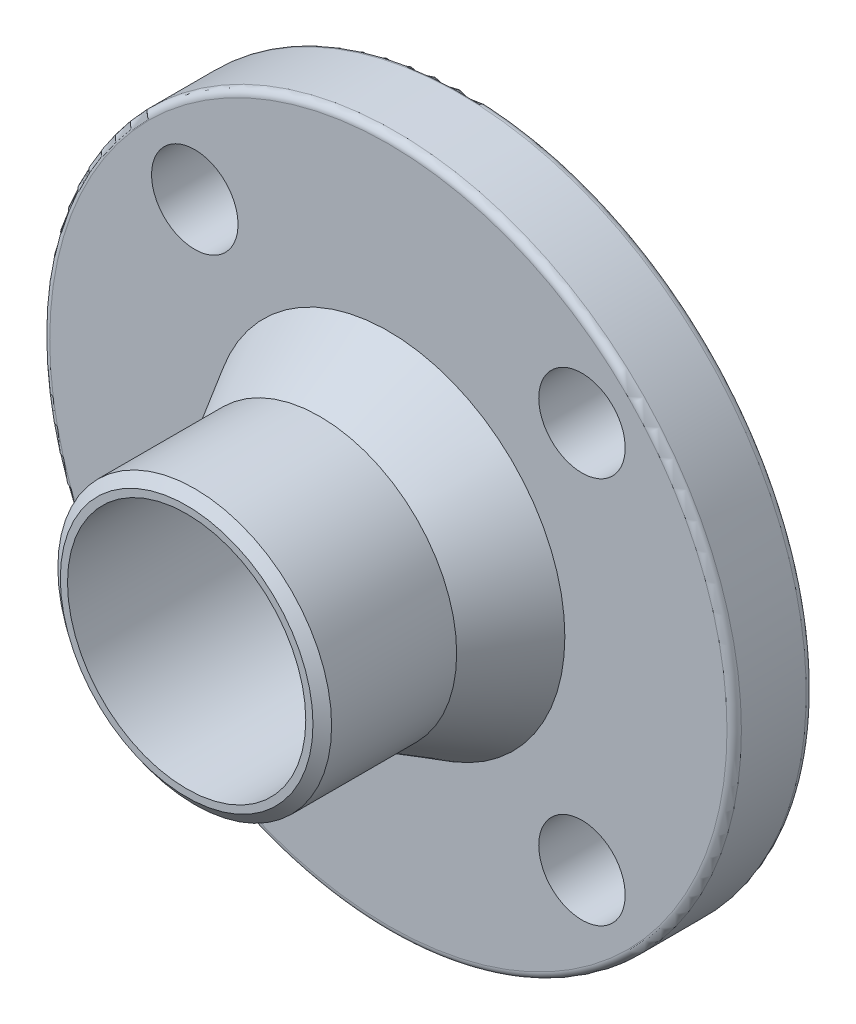
ISO-10303-21;
HEADER;
FILE_DESCRIPTION(('STEP AP214'),'2;1');
FILE_NAME('part.step','',(''),(''),'','','');
FILE_SCHEMA(('AUTOMOTIVE_DESIGN { 1 0 10303 214 1 1 1 1 }'));
ENDSEC;
DATA;
#1=APPLICATION_CONTEXT('core data for automotive mechanical design processes');
#2=APPLICATION_PROTOCOL_DEFINITION('international standard','automotive_design',2000,#1);
#3=PRODUCT_CONTEXT('',#1,'mechanical');
#4=PRODUCT('Part','Part','',(#3));
#5=PRODUCT_RELATED_PRODUCT_CATEGORY('part','',(#4));
#6=PRODUCT_DEFINITION_FORMATION('','',#4);
#7=PRODUCT_DEFINITION_CONTEXT('part definition',#1,'design');
#8=PRODUCT_DEFINITION('design','',#6,#7);
#9=PRODUCT_DEFINITION_SHAPE('','',#8);
#10=(LENGTH_UNIT() NAMED_UNIT(*) SI_UNIT(.MILLI.,.METRE.));
#11=(NAMED_UNIT(*) PLANE_ANGLE_UNIT() SI_UNIT($,.RADIAN.));
#12=(NAMED_UNIT(*) SI_UNIT($,.STERADIAN.) SOLID_ANGLE_UNIT());
#13=UNCERTAINTY_MEASURE_WITH_UNIT(LENGTH_MEASURE(1.E-05),#10,'distance_accuracy_value','');
#14=(GEOMETRIC_REPRESENTATION_CONTEXT(3) GLOBAL_UNCERTAINTY_ASSIGNED_CONTEXT((#13)) GLOBAL_UNIT_ASSIGNED_CONTEXT((#10,
#11,#12)) REPRESENTATION_CONTEXT('',''));
#15=CARTESIAN_POINT('',(0.,0.,0.));
#16=DIRECTION('',(0.,0.,1.));
#17=DIRECTION('',(1.,0.,0.));
#18=AXIS2_PLACEMENT_3D('',#15,#16,#17);
#19=CARTESIAN_POINT('',(0.,0.,0.));
#20=DIRECTION('',(0.,0.,1.));
#21=DIRECTION('',(1.,0.,0.));
#22=AXIS2_PLACEMENT_3D('',#19,#20,#21);
#23=PLANE('',#22);
#24=CARTESIAN_POINT('',(0.,0.,0.));
#25=DIRECTION('',(0.,0.,-1.));
#26=DIRECTION('',(-1.,0.,0.));
#27=AXIS2_PLACEMENT_3D('',#24,#25,#26);
#28=CIRCLE('',#27,46.0375);
#29=CARTESIAN_POINT('',(-46.0375,0.,0.));
#30=VERTEX_POINT('',#29);
#31=EDGE_CURVE('E82',#30,#30,#28,.T.);
#32=ORIENTED_EDGE('',*,*,#31,.T.);
#33=EDGE_LOOP('',(#32));
#34=FACE_BOUND('',#33,.T.);
#35=CARTESIAN_POINT('',(0.,0.,0.));
#36=DIRECTION('',(0.,0.,1.));
#37=DIRECTION('',(1.,0.,0.));
#38=AXIS2_PLACEMENT_3D('',#35,#36,#37);
#39=CIRCLE('',#38,26.2509);
#40=CARTESIAN_POINT('',(26.2509,0.,0.));
#41=VERTEX_POINT('',#40);
#42=EDGE_CURVE('E120',#41,#41,#39,.T.);
#43=ORIENTED_EDGE('',*,*,#42,.T.);
#44=EDGE_LOOP('',(#43));
#45=FACE_BOUND('',#44,.T.);
#46=ADVANCED_FACE('F39',(#34,#45),#23,.F.);
#47=CARTESIAN_POINT('',(0.,0.,63.5));
#48=DIRECTION('',(0.,0.,1.));
#49=DIRECTION('',(1.,0.,0.));
#50=AXIS2_PLACEMENT_3D('',#47,#48,#49);
#51=PLANE('',#50);
#52=CARTESIAN_POINT('',(0.,0.,63.5));
#53=DIRECTION('',(0.,0.,1.));
#54=DIRECTION('',(1.,0.,0.));
#55=AXIS2_PLACEMENT_3D('',#52,#53,#54);
#56=CIRCLE('',#55,27.8383999999348);
#57=CARTESIAN_POINT('',(27.8383999999348,0.,63.5));
#58=VERTEX_POINT('',#57);
#59=EDGE_CURVE('E72',#58,#58,#56,.T.);
#60=ORIENTED_EDGE('',*,*,#59,.T.);
#61=EDGE_LOOP('',(#60));
#62=FACE_BOUND('',#61,.T.);
#63=CARTESIAN_POINT('',(0.,0.,63.5));
#64=DIRECTION('',(0.,0.,1.));
#65=DIRECTION('',(1.,0.,0.));
#66=AXIS2_PLACEMENT_3D('',#63,#64,#65);
#67=CIRCLE('',#66,26.2509);
#68=CARTESIAN_POINT('',(26.2509,0.,63.5));
#69=VERTEX_POINT('',#68);
#70=EDGE_CURVE('E119',#69,#69,#67,.T.);
#71=ORIENTED_EDGE('',*,*,#70,.F.);
#72=EDGE_LOOP('',(#71));
#73=FACE_BOUND('',#72,.T.);
#74=ADVANCED_FACE('F131',(#62,#73),#51,.T.);
#75=CARTESIAN_POINT('',(0.,0.,19.05));
#76=DIRECTION('',(0.,0.,1.));
#77=DIRECTION('',(1.,0.,0.));
#78=AXIS2_PLACEMENT_3D('',#75,#76,#77);
#79=PLANE('',#78);
#80=CARTESIAN_POINT('',(0.,0.,19.05));
#81=DIRECTION('',(0.,0.,1.));
#82=DIRECTION('',(1.,0.,0.));
#83=AXIS2_PLACEMENT_3D('',#80,#81,#82);
#84=CIRCLE('',#83,74.6125);
#85=CARTESIAN_POINT('',(74.6125,0.,19.05));
#86=VERTEX_POINT('',#85);
#87=EDGE_CURVE('E47',#86,#86,#84,.T.);
#88=ORIENTED_EDGE('',*,*,#87,.T.);
#89=EDGE_LOOP('',(#88));
#90=FACE_BOUND('',#89,.T.);
#91=CARTESIAN_POINT('',(42.6562165750789,-42.6562165750781,19.05));
#92=DIRECTION('',(0.,0.,1.));
#93=DIRECTION('',(0.,-1.,0.));
#94=AXIS2_PLACEMENT_3D('',#91,#92,#93);
#95=CIRCLE('',#94,9.525);
#96=CARTESIAN_POINT('',(33.1312165750789,-42.6562165750781,19.05));
#97=VERTEX_POINT('',#96);
#98=EDGE_CURVE('E93',#97,#97,#95,.T.);
#99=ORIENTED_EDGE('',*,*,#98,.F.);
#100=EDGE_LOOP('',(#99));
#101=FACE_BOUND('',#100,.T.);
#102=CARTESIAN_POINT('',(-42.6562165750786,42.6562165750784,19.05));
#103=DIRECTION('',(0.,0.,1.));
#104=DIRECTION('',(0.,1.,0.));
#105=AXIS2_PLACEMENT_3D('',#102,#103,#104);
#106=CIRCLE('',#105,9.525);
#107=CARTESIAN_POINT('',(-52.1812165750786,42.6562165750784,19.05));
#108=VERTEX_POINT('',#107);
#109=EDGE_CURVE('E85',#108,#108,#106,.T.);
#110=ORIENTED_EDGE('',*,*,#109,.F.);
#111=EDGE_LOOP('',(#110));
#112=FACE_BOUND('',#111,.T.);
#113=CARTESIAN_POINT('',(42.6562165750785,42.6562165750784,19.05));
#114=DIRECTION('',(0.,0.,1.));
#115=DIRECTION('',(1.,0.,0.));
#116=AXIS2_PLACEMENT_3D('',#113,#114,#115);
#117=CIRCLE('',#116,9.525);
#118=CARTESIAN_POINT('',(33.1312165750785,42.6562165750784,19.05));
#119=VERTEX_POINT('',#118);
#120=EDGE_CURVE('E76',#119,#119,#117,.T.);
#121=ORIENTED_EDGE('',*,*,#120,.F.);
#122=EDGE_LOOP('',(#121));
#123=FACE_BOUND('',#122,.T.);
#124=CARTESIAN_POINT('',(-42.6562165750785,-42.6562165750784,19.05));
#125=DIRECTION('',(0.,0.,1.));
#126=DIRECTION('',(-1.,0.,0.));
#127=AXIS2_PLACEMENT_3D('',#124,#125,#126);
#128=CIRCLE('',#127,9.525);
#129=CARTESIAN_POINT('',(-52.1812165750785,-42.6562165750784,19.05));
#130=VERTEX_POINT('',#129);
#131=EDGE_CURVE('E89',#130,#130,#128,.T.);
#132=ORIENTED_EDGE('',*,*,#131,.F.);
#133=EDGE_LOOP('',(#132));
#134=FACE_BOUND('',#133,.T.);
#135=CARTESIAN_POINT('',(0.,0.,19.05));
#136=DIRECTION('',(0.,0.,1.));
#137=DIRECTION('',(1.,0.,0.));
#138=AXIS2_PLACEMENT_3D('',#135,#136,#137);
#139=CIRCLE('',#138,38.8874);
#140=CARTESIAN_POINT('',(38.8874,0.,19.05));
#141=VERTEX_POINT('',#140);
#142=EDGE_CURVE('E111',#141,#141,#139,.T.);
#143=ORIENTED_EDGE('',*,*,#142,.F.);
#144=EDGE_LOOP('',(#143));
#145=FACE_BOUND('',#144,.T.);
#146=ADVANCED_FACE('F133',(#90,#101,#112,#123,#134,#145),#79,.T.);
#147=CARTESIAN_POINT('',(0.,0.,19.05));
#148=DIRECTION('',(0.,0.,-1.));
#149=DIRECTION('',(-1.,0.,0.));
#150=AXIS2_PLACEMENT_3D('',#147,#148,#149);
#151=CYLINDRICAL_SURFACE('',#150,76.2);
#152=CARTESIAN_POINT('',(0.,0.,3.175));
#153=DIRECTION('',(0.,0.,-1.));
#154=DIRECTION('',(-1.,0.,0.));
#155=AXIS2_PLACEMENT_3D('',#152,#153,#154);
#156=CIRCLE('',#155,76.2);
#157=CARTESIAN_POINT('',(-76.2,0.,3.175));
#158=VERTEX_POINT('',#157);
#159=EDGE_CURVE('E53',#158,#158,#156,.F.);
#160=CARTESIAN_POINT('',(0.,0.,17.4625));
#161=DIRECTION('',(0.,0.,1.));
#162=DIRECTION('',(1.,0.,0.));
#163=AXIS2_PLACEMENT_3D('',#160,#161,#162);
#164=CIRCLE('',#163,76.2);
#165=CARTESIAN_POINT('',(-76.2,0.,17.4625));
#166=VERTEX_POINT('',#165);
#167=EDGE_CURVE('E59',#166,#166,#164,.F.);
#168=CARTESIAN_POINT('',(-76.2,0.,3.175));
#169=CARTESIAN_POINT('',(-76.2,0.,3.323828125));
#170=CARTESIAN_POINT('',(-76.2,0.,3.47265625));
#171=CARTESIAN_POINT('',(-76.2,0.,3.7703125));
#172=CARTESIAN_POINT('',(-76.2,0.,3.919140625));
#173=CARTESIAN_POINT('',(-76.2,0.,4.216796875));
#174=CARTESIAN_POINT('',(-76.2,0.,4.365625));
#175=CARTESIAN_POINT('',(-76.2,0.,4.66328125));
#176=CARTESIAN_POINT('',(-76.2,0.,4.812109375));
#177=CARTESIAN_POINT('',(-76.2,0.,5.109765625));
#178=CARTESIAN_POINT('',(-76.2,0.,5.25859375));
#179=CARTESIAN_POINT('',(-76.2,0.,5.55625));
#180=CARTESIAN_POINT('',(-76.2,0.,5.705078125));
#181=CARTESIAN_POINT('',(-76.2,0.,6.002734375));
#182=CARTESIAN_POINT('',(-76.2,0.,6.1515625));
#183=CARTESIAN_POINT('',(-76.2,0.,6.44921875));
#184=CARTESIAN_POINT('',(-76.2,0.,6.598046875));
#185=CARTESIAN_POINT('',(-76.2,0.,6.895703125));
#186=CARTESIAN_POINT('',(-76.2,0.,7.04453125));
#187=CARTESIAN_POINT('',(-76.2,0.,7.3421875));
#188=CARTESIAN_POINT('',(-76.2,0.,7.491015625));
#189=CARTESIAN_POINT('',(-76.2,0.,7.788671875));
#190=CARTESIAN_POINT('',(-76.2,0.,7.9375));
#191=CARTESIAN_POINT('',(-76.2,0.,8.23515625));
#192=CARTESIAN_POINT('',(-76.2,0.,8.383984375));
#193=CARTESIAN_POINT('',(-76.2,0.,8.681640625));
#194=CARTESIAN_POINT('',(-76.2,0.,8.83046875));
#195=CARTESIAN_POINT('',(-76.2,0.,9.128125));
#196=CARTESIAN_POINT('',(-76.2,0.,9.276953125));
#197=CARTESIAN_POINT('',(-76.2,0.,9.574609375));
#198=CARTESIAN_POINT('',(-76.2,0.,9.7234375));
#199=CARTESIAN_POINT('',(-76.2,0.,10.02109375));
#200=CARTESIAN_POINT('',(-76.2,0.,10.169921875));
#201=CARTESIAN_POINT('',(-76.2,0.,10.467578125));
#202=CARTESIAN_POINT('',(-76.2,0.,10.61640625));
#203=CARTESIAN_POINT('',(-76.2,0.,10.9140625));
#204=CARTESIAN_POINT('',(-76.2,0.,11.062890625));
#205=CARTESIAN_POINT('',(-76.2,0.,11.360546875));
#206=CARTESIAN_POINT('',(-76.2,0.,11.509375));
#207=CARTESIAN_POINT('',(-76.2,0.,11.80703125));
#208=CARTESIAN_POINT('',(-76.2,0.,11.955859375));
#209=CARTESIAN_POINT('',(-76.2,0.,12.253515625));
#210=CARTESIAN_POINT('',(-76.2,0.,12.40234375));
#211=CARTESIAN_POINT('',(-76.2,0.,12.7));
#212=CARTESIAN_POINT('',(-76.2,0.,12.848828125));
#213=CARTESIAN_POINT('',(-76.2,0.,13.146484375));
#214=CARTESIAN_POINT('',(-76.2,0.,13.2953125));
#215=CARTESIAN_POINT('',(-76.2,0.,13.59296875));
#216=CARTESIAN_POINT('',(-76.2,0.,13.741796875));
#217=CARTESIAN_POINT('',(-76.2,0.,14.039453125));
#218=CARTESIAN_POINT('',(-76.2,0.,14.18828125));
#219=CARTESIAN_POINT('',(-76.2,0.,14.4859375));
#220=CARTESIAN_POINT('',(-76.2,0.,14.634765625));
#221=CARTESIAN_POINT('',(-76.2,0.,14.932421875));
#222=CARTESIAN_POINT('',(-76.2,0.,15.08125));
#223=CARTESIAN_POINT('',(-76.2,0.,15.37890625));
#224=CARTESIAN_POINT('',(-76.2,0.,15.527734375));
#225=CARTESIAN_POINT('',(-76.2,0.,15.825390625));
#226=CARTESIAN_POINT('',(-76.2,0.,15.97421875));
#227=CARTESIAN_POINT('',(-76.2,0.,16.271875));
#228=CARTESIAN_POINT('',(-76.2,0.,16.420703125));
#229=CARTESIAN_POINT('',(-76.2,0.,16.718359375));
#230=CARTESIAN_POINT('',(-76.2,0.,16.8671875));
#231=CARTESIAN_POINT('',(-76.2,0.,17.16484375));
#232=CARTESIAN_POINT('',(-76.2,0.,17.313671875));
#233=CARTESIAN_POINT('',(-76.2,0.,17.4625));
#234=B_SPLINE_CURVE_WITH_KNOTS('',3,(#168,#169,#170,#171,#172,#173,#174,#175,#176,#177,#178,
#179,#180,#181,#182,#183,#184,#185,#186,#187,#188,#189,#190,#191,#192,#193,#194,#195,#196,#197,
#198,#199,#200,#201,#202,#203,#204,#205,#206,#207,#208,#209,#210,#211,#212,#213,#214,#215,#216,
#217,#218,#219,#220,#221,#222,#223,#224,#225,#226,#227,#228,#229,#230,#231,#232,#233),
.UNSPECIFIED.,.F.,.F.,(4,2,2,2,2,2,2,2,2,2,2,2,2,2,2,2,2,2,2,2,2,2,2,2,2,2,2,2,2,2,2,2,4),(0.,
0.446484374999999,0.892968749999999,1.339453125,1.7859375,2.232421875,2.67890625,3.125390625,
3.571875,4.018359375,4.46484375,4.911328125,5.3578125,5.804296875,6.25078125,6.697265625,
7.14375,7.590234375,8.03671875,8.483203125,8.9296875,9.376171875,9.82265625,10.269140625,
10.715625,11.162109375,11.60859375,12.055078125,12.5015625,12.948046875,13.39453125,
13.841015625,14.2875),.UNSPECIFIED.);
#235=EDGE_CURVE('BSEAM140',#158,#166,#234,.T.);
#236=ORIENTED_EDGE('',*,*,#159,.T.);
#237=ORIENTED_EDGE('',*,*,#167,.T.);
#238=ORIENTED_EDGE('',*,*,#235,.T.);
#239=ORIENTED_EDGE('',*,*,#235,.F.);
#240=EDGE_LOOP('',(#236,#238,#237,#239));
#241=FACE_BOUND('',#240,.T.);
#242=ADVANCED_FACE('F140',(#241),#151,.T.);
#243=CARTESIAN_POINT('',(42.6562165750785,42.6562165750784,19.05));
#244=DIRECTION('',(0.,0.,-1.));
#245=DIRECTION('',(-1.,0.,0.));
#246=AXIS2_PLACEMENT_3D('',#243,#244,#245);
#247=CYLINDRICAL_SURFACE('',#246,9.525);
#248=CARTESIAN_POINT('',(42.6562165750785,42.6562165750784,1.5875));
#249=DIRECTION('',(0.,0.,-1.));
#250=DIRECTION('',(-1.,0.,0.));
#251=AXIS2_PLACEMENT_3D('',#248,#249,#250);
#252=CIRCLE('',#251,9.525);
#253=CARTESIAN_POINT('',(33.1312165750785,42.6562165750784,1.5875));
#254=VERTEX_POINT('',#253);
#255=EDGE_CURVE('E97',#254,#254,#252,.T.);
#256=CARTESIAN_POINT('',(33.1312165750785,42.6562165750784,19.05));
#257=CARTESIAN_POINT('',(33.1312165750785,42.6562165750784,18.8680989583333));
#258=CARTESIAN_POINT('',(33.1312165750785,42.6562165750784,18.6861979166667));
#259=CARTESIAN_POINT('',(33.1312165750785,42.6562165750784,18.3223958333333));
#260=CARTESIAN_POINT('',(33.1312165750785,42.6562165750784,18.1404947916667));
#261=CARTESIAN_POINT('',(33.1312165750785,42.6562165750784,17.7766927083333));
#262=CARTESIAN_POINT('',(33.1312165750785,42.6562165750784,17.5947916666667));
#263=CARTESIAN_POINT('',(33.1312165750785,42.6562165750784,17.2309895833333));
#264=CARTESIAN_POINT('',(33.1312165750785,42.6562165750784,17.0490885416667));
#265=CARTESIAN_POINT('',(33.1312165750785,42.6562165750784,16.6852864583333));
#266=CARTESIAN_POINT('',(33.1312165750785,42.6562165750784,16.5033854166667));
#267=CARTESIAN_POINT('',(33.1312165750785,42.6562165750784,16.1395833333333));
#268=CARTESIAN_POINT('',(33.1312165750785,42.6562165750784,15.9576822916667));
#269=CARTESIAN_POINT('',(33.1312165750785,42.6562165750784,15.5938802083333));
#270=CARTESIAN_POINT('',(33.1312165750785,42.6562165750784,15.4119791666667));
#271=CARTESIAN_POINT('',(33.1312165750785,42.6562165750784,15.0481770833333));
#272=CARTESIAN_POINT('',(33.1312165750785,42.6562165750784,14.8662760416667));
#273=CARTESIAN_POINT('',(33.1312165750785,42.6562165750784,14.5024739583333));
#274=CARTESIAN_POINT('',(33.1312165750785,42.6562165750784,14.3205729166667));
#275=CARTESIAN_POINT('',(33.1312165750785,42.6562165750784,13.9567708333333));
#276=CARTESIAN_POINT('',(33.1312165750785,42.6562165750784,13.7748697916667));
#277=CARTESIAN_POINT('',(33.1312165750785,42.6562165750784,13.4110677083333));
#278=CARTESIAN_POINT('',(33.1312165750785,42.6562165750784,13.2291666666667));
#279=CARTESIAN_POINT('',(33.1312165750785,42.6562165750784,12.8653645833333));
#280=CARTESIAN_POINT('',(33.1312165750785,42.6562165750784,12.6834635416667));
#281=CARTESIAN_POINT('',(33.1312165750785,42.6562165750784,12.3196614583333));
#282=CARTESIAN_POINT('',(33.1312165750785,42.6562165750784,12.1377604166667));
#283=CARTESIAN_POINT('',(33.1312165750785,42.6562165750784,11.7739583333333));
#284=CARTESIAN_POINT('',(33.1312165750785,42.6562165750784,11.5920572916667));
#285=CARTESIAN_POINT('',(33.1312165750785,42.6562165750784,11.2282552083333));
#286=CARTESIAN_POINT('',(33.1312165750785,42.6562165750784,11.0463541666667));
#287=CARTESIAN_POINT('',(33.1312165750785,42.6562165750784,10.6825520833333));
#288=CARTESIAN_POINT('',(33.1312165750785,42.6562165750784,10.5006510416667));
#289=CARTESIAN_POINT('',(33.1312165750785,42.6562165750784,10.1368489583333));
#290=CARTESIAN_POINT('',(33.1312165750785,42.6562165750784,9.95494791666667));
#291=CARTESIAN_POINT('',(33.1312165750785,42.6562165750784,9.59114583333333));
#292=CARTESIAN_POINT('',(33.1312165750785,42.6562165750784,9.40924479166667));
#293=CARTESIAN_POINT('',(33.1312165750785,42.6562165750784,9.04544270833333));
#294=CARTESIAN_POINT('',(33.1312165750785,42.6562165750784,8.86354166666666));
#295=CARTESIAN_POINT('',(33.1312165750785,42.6562165750784,8.49973958333333));
#296=CARTESIAN_POINT('',(33.1312165750785,42.6562165750784,8.31783854166666));
#297=CARTESIAN_POINT('',(33.1312165750785,42.6562165750784,7.95403645833333));
#298=CARTESIAN_POINT('',(33.1312165750785,42.6562165750784,7.77213541666666));
#299=CARTESIAN_POINT('',(33.1312165750785,42.6562165750784,7.40833333333333));
#300=CARTESIAN_POINT('',(33.1312165750785,42.6562165750784,7.22643229166666));
#301=CARTESIAN_POINT('',(33.1312165750785,42.6562165750784,6.86263020833333));
#302=CARTESIAN_POINT('',(33.1312165750785,42.6562165750784,6.68072916666666));
#303=CARTESIAN_POINT('',(33.1312165750785,42.6562165750784,6.31692708333333));
#304=CARTESIAN_POINT('',(33.1312165750785,42.6562165750784,6.13502604166666));
#305=CARTESIAN_POINT('',(33.1312165750785,42.6562165750784,5.77122395833333));
#306=CARTESIAN_POINT('',(33.1312165750785,42.6562165750784,5.58932291666666));
#307=CARTESIAN_POINT('',(33.1312165750785,42.6562165750784,5.22552083333333));
#308=CARTESIAN_POINT('',(33.1312165750785,42.6562165750784,5.04361979166666));
#309=CARTESIAN_POINT('',(33.1312165750785,42.6562165750784,4.67981770833333));
#310=CARTESIAN_POINT('',(33.1312165750785,42.6562165750784,4.49791666666666));
#311=CARTESIAN_POINT('',(33.1312165750785,42.6562165750784,4.13411458333333));
#312=CARTESIAN_POINT('',(33.1312165750785,42.6562165750784,3.95221354166666));
#313=CARTESIAN_POINT('',(33.1312165750785,42.6562165750784,3.58841145833333));
#314=CARTESIAN_POINT('',(33.1312165750785,42.6562165750784,3.40651041666667));
#315=CARTESIAN_POINT('',(33.1312165750785,42.6562165750784,3.04270833333333));
#316=CARTESIAN_POINT('',(33.1312165750785,42.6562165750784,2.86080729166667));
#317=CARTESIAN_POINT('',(33.1312165750785,42.6562165750784,2.49700520833333));
#318=CARTESIAN_POINT('',(33.1312165750785,42.6562165750784,2.31510416666667));
#319=CARTESIAN_POINT('',(33.1312165750785,42.6562165750784,1.95130208333333));
#320=CARTESIAN_POINT('',(33.1312165750785,42.6562165750784,1.76940104166667));
#321=CARTESIAN_POINT('',(33.1312165750785,42.6562165750784,1.5875));
#322=B_SPLINE_CURVE_WITH_KNOTS('',3,(#256,#257,#258,#259,#260,#261,#262,#263,#264,#265,#266,
#267,#268,#269,#270,#271,#272,#273,#274,#275,#276,#277,#278,#279,#280,#281,#282,#283,#284,#285,
#286,#287,#288,#289,#290,#291,#292,#293,#294,#295,#296,#297,#298,#299,#300,#301,#302,#303,#304,
#305,#306,#307,#308,#309,#310,#311,#312,#313,#314,#315,#316,#317,#318,#319,#320,#321),
.UNSPECIFIED.,.F.,.F.,(4,2,2,2,2,2,2,2,2,2,2,2,2,2,2,2,2,2,2,2,2,2,2,2,2,2,2,2,2,2,2,2,4),(0.,
0.545703125000002,1.09140625,1.637109375,2.1828125,2.728515625,3.27421875,3.819921875,4.365625,
4.911328125,5.45703125,6.002734375,6.5484375,7.094140625,7.63984375,8.185546875,8.73125,
9.276953125,9.82265625,10.368359375,10.9140625,11.459765625,12.00546875,12.551171875,13.096875,
13.642578125,14.18828125,14.733984375,15.2796875,15.825390625,16.37109375,16.916796875,17.4625),.UNSPECIFIED.);
#323=EDGE_CURVE('BSEAM162',#119,#254,#322,.T.);
#324=ORIENTED_EDGE('',*,*,#120,.T.);
#325=ORIENTED_EDGE('',*,*,#255,.T.);
#326=ORIENTED_EDGE('',*,*,#323,.T.);
#327=ORIENTED_EDGE('',*,*,#323,.F.);
#328=EDGE_LOOP('',(#324,#326,#325,#327));
#329=FACE_BOUND('',#328,.T.);
#330=ADVANCED_FACE('F162',(#329),#247,.F.);
#331=CARTESIAN_POINT('',(-42.6562165750786,42.6562165750784,19.05));
#332=DIRECTION('',(0.,0.,-1.));
#333=DIRECTION('',(-1.,0.,0.));
#334=AXIS2_PLACEMENT_3D('',#331,#332,#333);
#335=CYLINDRICAL_SURFACE('',#334,9.525);
#336=CARTESIAN_POINT('',(-42.6562165750786,42.6562165750784,1.5875));
#337=DIRECTION('',(0.,0.,-1.));
#338=DIRECTION('',(-1.,0.,0.));
#339=AXIS2_PLACEMENT_3D('',#336,#337,#338);
#340=CIRCLE('',#339,9.525);
#341=CARTESIAN_POINT('',(-52.1812165750786,42.6562165750784,1.5875));
#342=VERTEX_POINT('',#341);
#343=EDGE_CURVE('E101',#342,#342,#340,.T.);
#344=CARTESIAN_POINT('',(-52.1812165750786,42.6562165750784,19.05));
#345=CARTESIAN_POINT('',(-52.1812165750786,42.6562165750784,18.8680989583333));
#346=CARTESIAN_POINT('',(-52.1812165750786,42.6562165750784,18.6861979166667));
#347=CARTESIAN_POINT('',(-52.1812165750786,42.6562165750784,18.3223958333333));
#348=CARTESIAN_POINT('',(-52.1812165750786,42.6562165750784,18.1404947916667));
#349=CARTESIAN_POINT('',(-52.1812165750786,42.6562165750784,17.7766927083333));
#350=CARTESIAN_POINT('',(-52.1812165750786,42.6562165750784,17.5947916666667));
#351=CARTESIAN_POINT('',(-52.1812165750786,42.6562165750784,17.2309895833333));
#352=CARTESIAN_POINT('',(-52.1812165750786,42.6562165750784,17.0490885416667));
#353=CARTESIAN_POINT('',(-52.1812165750786,42.6562165750784,16.6852864583333));
#354=CARTESIAN_POINT('',(-52.1812165750786,42.6562165750784,16.5033854166667));
#355=CARTESIAN_POINT('',(-52.1812165750786,42.6562165750784,16.1395833333333));
#356=CARTESIAN_POINT('',(-52.1812165750786,42.6562165750784,15.9576822916667));
#357=CARTESIAN_POINT('',(-52.1812165750786,42.6562165750784,15.5938802083333));
#358=CARTESIAN_POINT('',(-52.1812165750786,42.6562165750784,15.4119791666667));
#359=CARTESIAN_POINT('',(-52.1812165750786,42.6562165750784,15.0481770833333));
#360=CARTESIAN_POINT('',(-52.1812165750786,42.6562165750784,14.8662760416667));
#361=CARTESIAN_POINT('',(-52.1812165750786,42.6562165750784,14.5024739583333));
#362=CARTESIAN_POINT('',(-52.1812165750786,42.6562165750784,14.3205729166667));
#363=CARTESIAN_POINT('',(-52.1812165750786,42.6562165750784,13.9567708333333));
#364=CARTESIAN_POINT('',(-52.1812165750786,42.6562165750784,13.7748697916667));
#365=CARTESIAN_POINT('',(-52.1812165750786,42.6562165750784,13.4110677083333));
#366=CARTESIAN_POINT('',(-52.1812165750786,42.6562165750784,13.2291666666667));
#367=CARTESIAN_POINT('',(-52.1812165750786,42.6562165750784,12.8653645833333));
#368=CARTESIAN_POINT('',(-52.1812165750786,42.6562165750784,12.6834635416667));
#369=CARTESIAN_POINT('',(-52.1812165750786,42.6562165750784,12.3196614583333));
#370=CARTESIAN_POINT('',(-52.1812165750786,42.6562165750784,12.1377604166667));
#371=CARTESIAN_POINT('',(-52.1812165750786,42.6562165750784,11.7739583333333));
#372=CARTESIAN_POINT('',(-52.1812165750786,42.6562165750784,11.5920572916667));
#373=CARTESIAN_POINT('',(-52.1812165750786,42.6562165750784,11.2282552083333));
#374=CARTESIAN_POINT('',(-52.1812165750786,42.6562165750784,11.0463541666667));
#375=CARTESIAN_POINT('',(-52.1812165750786,42.6562165750784,10.6825520833333));
#376=CARTESIAN_POINT('',(-52.1812165750786,42.6562165750784,10.5006510416667));
#377=CARTESIAN_POINT('',(-52.1812165750786,42.6562165750784,10.1368489583333));
#378=CARTESIAN_POINT('',(-52.1812165750786,42.6562165750784,9.95494791666667));
#379=CARTESIAN_POINT('',(-52.1812165750786,42.6562165750784,9.59114583333333));
#380=CARTESIAN_POINT('',(-52.1812165750786,42.6562165750784,9.40924479166667));
#381=CARTESIAN_POINT('',(-52.1812165750786,42.6562165750784,9.04544270833333));
#382=CARTESIAN_POINT('',(-52.1812165750786,42.6562165750784,8.86354166666666));
#383=CARTESIAN_POINT('',(-52.1812165750786,42.6562165750784,8.49973958333333));
#384=CARTESIAN_POINT('',(-52.1812165750786,42.6562165750784,8.31783854166666));
#385=CARTESIAN_POINT('',(-52.1812165750786,42.6562165750784,7.95403645833333));
#386=CARTESIAN_POINT('',(-52.1812165750786,42.6562165750784,7.77213541666666));
#387=CARTESIAN_POINT('',(-52.1812165750786,42.6562165750784,7.40833333333333));
#388=CARTESIAN_POINT('',(-52.1812165750786,42.6562165750784,7.22643229166666));
#389=CARTESIAN_POINT('',(-52.1812165750786,42.6562165750784,6.86263020833333));
#390=CARTESIAN_POINT('',(-52.1812165750786,42.6562165750784,6.68072916666666));
#391=CARTESIAN_POINT('',(-52.1812165750786,42.6562165750784,6.31692708333333));
#392=CARTESIAN_POINT('',(-52.1812165750786,42.6562165750784,6.13502604166666));
#393=CARTESIAN_POINT('',(-52.1812165750786,42.6562165750784,5.77122395833333));
#394=CARTESIAN_POINT('',(-52.1812165750786,42.6562165750784,5.58932291666666));
#395=CARTESIAN_POINT('',(-52.1812165750786,42.6562165750784,5.22552083333333));
#396=CARTESIAN_POINT('',(-52.1812165750786,42.6562165750784,5.04361979166666));
#397=CARTESIAN_POINT('',(-52.1812165750786,42.6562165750784,4.67981770833333));
#398=CARTESIAN_POINT('',(-52.1812165750786,42.6562165750784,4.49791666666666));
#399=CARTESIAN_POINT('',(-52.1812165750786,42.6562165750784,4.13411458333333));
#400=CARTESIAN_POINT('',(-52.1812165750786,42.6562165750784,3.95221354166666));
#401=CARTESIAN_POINT('',(-52.1812165750786,42.6562165750784,3.58841145833333));
#402=CARTESIAN_POINT('',(-52.1812165750786,42.6562165750784,3.40651041666667));
#403=CARTESIAN_POINT('',(-52.1812165750786,42.6562165750784,3.04270833333333));
#404=CARTESIAN_POINT('',(-52.1812165750786,42.6562165750784,2.86080729166667));
#405=CARTESIAN_POINT('',(-52.1812165750786,42.6562165750784,2.49700520833333));
#406=CARTESIAN_POINT('',(-52.1812165750786,42.6562165750784,2.31510416666667));
#407=CARTESIAN_POINT('',(-52.1812165750786,42.6562165750784,1.95130208333333));
#408=CARTESIAN_POINT('',(-52.1812165750786,42.6562165750784,1.76940104166667));
#409=CARTESIAN_POINT('',(-52.1812165750786,42.6562165750784,1.5875));
#410=B_SPLINE_CURVE_WITH_KNOTS('',3,(#344,#345,#346,#347,#348,#349,#350,#351,#352,#353,#354,
#355,#356,#357,#358,#359,#360,#361,#362,#363,#364,#365,#366,#367,#368,#369,#370,#371,#372,#373,
#374,#375,#376,#377,#378,#379,#380,#381,#382,#383,#384,#385,#386,#387,#388,#389,#390,#391,#392,
#393,#394,#395,#396,#397,#398,#399,#400,#401,#402,#403,#404,#405,#406,#407,#408,#409),
.UNSPECIFIED.,.F.,.F.,(4,2,2,2,2,2,2,2,2,2,2,2,2,2,2,2,2,2,2,2,2,2,2,2,2,2,2,2,2,2,2,2,4),(0.,
0.545703125000002,1.09140625,1.637109375,2.1828125,2.728515625,3.27421875,3.819921875,4.365625,
4.911328125,5.45703125,6.002734375,6.5484375,7.094140625,7.63984375,8.185546875,8.73125,
9.276953125,9.82265625,10.368359375,10.9140625,11.459765625,12.00546875,12.551171875,13.096875,
13.642578125,14.18828125,14.733984375,15.2796875,15.825390625,16.37109375,16.916796875,17.4625),.UNSPECIFIED.);
#411=EDGE_CURVE('BSEAM158',#108,#342,#410,.T.);
#412=ORIENTED_EDGE('',*,*,#109,.T.);
#413=ORIENTED_EDGE('',*,*,#343,.T.);
#414=ORIENTED_EDGE('',*,*,#411,.T.);
#415=ORIENTED_EDGE('',*,*,#411,.F.);
#416=EDGE_LOOP('',(#412,#414,#413,#415));
#417=FACE_BOUND('',#416,.T.);
#418=ADVANCED_FACE('F158',(#417),#335,.F.);
#419=CARTESIAN_POINT('',(-42.6562165750785,-42.6562165750784,19.05));
#420=DIRECTION('',(0.,0.,-1.));
#421=DIRECTION('',(-1.,0.,0.));
#422=AXIS2_PLACEMENT_3D('',#419,#420,#421);
#423=CYLINDRICAL_SURFACE('',#422,9.525);
#424=CARTESIAN_POINT('',(-42.6562165750785,-42.6562165750784,1.5875));
#425=DIRECTION('',(0.,0.,-1.));
#426=DIRECTION('',(-1.,0.,0.));
#427=AXIS2_PLACEMENT_3D('',#424,#425,#426);
#428=CIRCLE('',#427,9.525);
#429=CARTESIAN_POINT('',(-52.1812165750785,-42.6562165750784,1.5875));
#430=VERTEX_POINT('',#429);
#431=EDGE_CURVE('E81',#430,#430,#428,.T.);
#432=CARTESIAN_POINT('',(-52.1812165750785,-42.6562165750784,19.05));
#433=CARTESIAN_POINT('',(-52.1812165750785,-42.6562165750784,18.8680989583333));
#434=CARTESIAN_POINT('',(-52.1812165750785,-42.6562165750784,18.6861979166667));
#435=CARTESIAN_POINT('',(-52.1812165750785,-42.6562165750784,18.3223958333333));
#436=CARTESIAN_POINT('',(-52.1812165750785,-42.6562165750784,18.1404947916667));
#437=CARTESIAN_POINT('',(-52.1812165750785,-42.6562165750784,17.7766927083333));
#438=CARTESIAN_POINT('',(-52.1812165750785,-42.6562165750784,17.5947916666667));
#439=CARTESIAN_POINT('',(-52.1812165750785,-42.6562165750784,17.2309895833333));
#440=CARTESIAN_POINT('',(-52.1812165750785,-42.6562165750784,17.0490885416667));
#441=CARTESIAN_POINT('',(-52.1812165750785,-42.6562165750784,16.6852864583333));
#442=CARTESIAN_POINT('',(-52.1812165750785,-42.6562165750784,16.5033854166667));
#443=CARTESIAN_POINT('',(-52.1812165750785,-42.6562165750784,16.1395833333333));
#444=CARTESIAN_POINT('',(-52.1812165750785,-42.6562165750784,15.9576822916667));
#445=CARTESIAN_POINT('',(-52.1812165750785,-42.6562165750784,15.5938802083333));
#446=CARTESIAN_POINT('',(-52.1812165750785,-42.6562165750784,15.4119791666667));
#447=CARTESIAN_POINT('',(-52.1812165750785,-42.6562165750784,15.0481770833333));
#448=CARTESIAN_POINT('',(-52.1812165750785,-42.6562165750784,14.8662760416667));
#449=CARTESIAN_POINT('',(-52.1812165750785,-42.6562165750784,14.5024739583333));
#450=CARTESIAN_POINT('',(-52.1812165750785,-42.6562165750784,14.3205729166667));
#451=CARTESIAN_POINT('',(-52.1812165750785,-42.6562165750784,13.9567708333333));
#452=CARTESIAN_POINT('',(-52.1812165750785,-42.6562165750784,13.7748697916667));
#453=CARTESIAN_POINT('',(-52.1812165750785,-42.6562165750784,13.4110677083333));
#454=CARTESIAN_POINT('',(-52.1812165750785,-42.6562165750784,13.2291666666667));
#455=CARTESIAN_POINT('',(-52.1812165750785,-42.6562165750784,12.8653645833333));
#456=CARTESIAN_POINT('',(-52.1812165750785,-42.6562165750784,12.6834635416667));
#457=CARTESIAN_POINT('',(-52.1812165750785,-42.6562165750784,12.3196614583333));
#458=CARTESIAN_POINT('',(-52.1812165750785,-42.6562165750784,12.1377604166667));
#459=CARTESIAN_POINT('',(-52.1812165750785,-42.6562165750784,11.7739583333333));
#460=CARTESIAN_POINT('',(-52.1812165750785,-42.6562165750784,11.5920572916667));
#461=CARTESIAN_POINT('',(-52.1812165750785,-42.6562165750784,11.2282552083333));
#462=CARTESIAN_POINT('',(-52.1812165750785,-42.6562165750784,11.0463541666667));
#463=CARTESIAN_POINT('',(-52.1812165750785,-42.6562165750784,10.6825520833333));
#464=CARTESIAN_POINT('',(-52.1812165750785,-42.6562165750784,10.5006510416667));
#465=CARTESIAN_POINT('',(-52.1812165750785,-42.6562165750784,10.1368489583333));
#466=CARTESIAN_POINT('',(-52.1812165750785,-42.6562165750784,9.95494791666667));
#467=CARTESIAN_POINT('',(-52.1812165750785,-42.6562165750784,9.59114583333333));
#468=CARTESIAN_POINT('',(-52.1812165750785,-42.6562165750784,9.40924479166667));
#469=CARTESIAN_POINT('',(-52.1812165750785,-42.6562165750784,9.04544270833333));
#470=CARTESIAN_POINT('',(-52.1812165750785,-42.6562165750784,8.86354166666666));
#471=CARTESIAN_POINT('',(-52.1812165750785,-42.6562165750784,8.49973958333333));
#472=CARTESIAN_POINT('',(-52.1812165750785,-42.6562165750784,8.31783854166666));
#473=CARTESIAN_POINT('',(-52.1812165750785,-42.6562165750784,7.95403645833333));
#474=CARTESIAN_POINT('',(-52.1812165750785,-42.6562165750784,7.77213541666666));
#475=CARTESIAN_POINT('',(-52.1812165750785,-42.6562165750784,7.40833333333333));
#476=CARTESIAN_POINT('',(-52.1812165750785,-42.6562165750784,7.22643229166666));
#477=CARTESIAN_POINT('',(-52.1812165750785,-42.6562165750784,6.86263020833333));
#478=CARTESIAN_POINT('',(-52.1812165750785,-42.6562165750784,6.68072916666666));
#479=CARTESIAN_POINT('',(-52.1812165750785,-42.6562165750784,6.31692708333333));
#480=CARTESIAN_POINT('',(-52.1812165750785,-42.6562165750784,6.13502604166666));
#481=CARTESIAN_POINT('',(-52.1812165750785,-42.6562165750784,5.77122395833333));
#482=CARTESIAN_POINT('',(-52.1812165750785,-42.6562165750784,5.58932291666666));
#483=CARTESIAN_POINT('',(-52.1812165750785,-42.6562165750784,5.22552083333333));
#484=CARTESIAN_POINT('',(-52.1812165750785,-42.6562165750784,5.04361979166666));
#485=CARTESIAN_POINT('',(-52.1812165750785,-42.6562165750784,4.67981770833333));
#486=CARTESIAN_POINT('',(-52.1812165750785,-42.6562165750784,4.49791666666666));
#487=CARTESIAN_POINT('',(-52.1812165750785,-42.6562165750784,4.13411458333333));
#488=CARTESIAN_POINT('',(-52.1812165750785,-42.6562165750784,3.95221354166666));
#489=CARTESIAN_POINT('',(-52.1812165750785,-42.6562165750784,3.58841145833333));
#490=CARTESIAN_POINT('',(-52.1812165750785,-42.6562165750784,3.40651041666667));
#491=CARTESIAN_POINT('',(-52.1812165750785,-42.6562165750784,3.04270833333333));
#492=CARTESIAN_POINT('',(-52.1812165750785,-42.6562165750784,2.86080729166667));
#493=CARTESIAN_POINT('',(-52.1812165750785,-42.6562165750784,2.49700520833333));
#494=CARTESIAN_POINT('',(-52.1812165750785,-42.6562165750784,2.31510416666667));
#495=CARTESIAN_POINT('',(-52.1812165750785,-42.6562165750784,1.95130208333333));
#496=CARTESIAN_POINT('',(-52.1812165750785,-42.6562165750784,1.76940104166667));
#497=CARTESIAN_POINT('',(-52.1812165750785,-42.6562165750784,1.5875));
#498=B_SPLINE_CURVE_WITH_KNOTS('',3,(#432,#433,#434,#435,#436,#437,#438,#439,#440,#441,#442,
#443,#444,#445,#446,#447,#448,#449,#450,#451,#452,#453,#454,#455,#456,#457,#458,#459,#460,#461,
#462,#463,#464,#465,#466,#467,#468,#469,#470,#471,#472,#473,#474,#475,#476,#477,#478,#479,#480,
#481,#482,#483,#484,#485,#486,#487,#488,#489,#490,#491,#492,#493,#494,#495,#496,#497),
.UNSPECIFIED.,.F.,.F.,(4,2,2,2,2,2,2,2,2,2,2,2,2,2,2,2,2,2,2,2,2,2,2,2,2,2,2,2,2,2,2,2,4),(0.,
0.545703125000002,1.09140625,1.637109375,2.1828125,2.728515625,3.27421875,3.819921875,4.365625,
4.911328125,5.45703125,6.002734375,6.5484375,7.094140625,7.63984375,8.185546875,8.73125,
9.276953125,9.82265625,10.368359375,10.9140625,11.459765625,12.00546875,12.551171875,13.096875,
13.642578125,14.18828125,14.733984375,15.2796875,15.825390625,16.37109375,16.916796875,17.4625),.UNSPECIFIED.);
#499=EDGE_CURVE('BSEAM154',#130,#430,#498,.T.);
#500=ORIENTED_EDGE('',*,*,#131,.T.);
#501=ORIENTED_EDGE('',*,*,#431,.T.);
#502=ORIENTED_EDGE('',*,*,#499,.T.);
#503=ORIENTED_EDGE('',*,*,#499,.F.);
#504=EDGE_LOOP('',(#500,#502,#501,#503));
#505=FACE_BOUND('',#504,.T.);
#506=ADVANCED_FACE('F154',(#505),#423,.F.);
#507=CARTESIAN_POINT('',(42.6562165750789,-42.6562165750781,19.05));
#508=DIRECTION('',(0.,0.,-1.));
#509=DIRECTION('',(-1.,0.,0.));
#510=AXIS2_PLACEMENT_3D('',#507,#508,#509);
#511=CYLINDRICAL_SURFACE('',#510,9.525);
#512=CARTESIAN_POINT('',(42.6562165750789,-42.6562165750781,1.5875));
#513=DIRECTION('',(0.,0.,-1.));
#514=DIRECTION('',(-1.,0.,0.));
#515=AXIS2_PLACEMENT_3D('',#512,#513,#514);
#516=CIRCLE('',#515,9.525);
#517=CARTESIAN_POINT('',(33.1312165750789,-42.6562165750781,1.5875));
#518=VERTEX_POINT('',#517);
#519=EDGE_CURVE('E77',#518,#518,#516,.T.);
#520=CARTESIAN_POINT('',(33.1312165750789,-42.6562165750781,19.05));
#521=CARTESIAN_POINT('',(33.1312165750789,-42.6562165750781,18.8680989583333));
#522=CARTESIAN_POINT('',(33.1312165750789,-42.6562165750781,18.6861979166667));
#523=CARTESIAN_POINT('',(33.1312165750789,-42.6562165750781,18.3223958333333));
#524=CARTESIAN_POINT('',(33.1312165750789,-42.6562165750781,18.1404947916667));
#525=CARTESIAN_POINT('',(33.1312165750789,-42.6562165750781,17.7766927083333));
#526=CARTESIAN_POINT('',(33.1312165750789,-42.6562165750781,17.5947916666667));
#527=CARTESIAN_POINT('',(33.1312165750789,-42.6562165750781,17.2309895833333));
#528=CARTESIAN_POINT('',(33.1312165750789,-42.6562165750781,17.0490885416667));
#529=CARTESIAN_POINT('',(33.1312165750789,-42.6562165750781,16.6852864583333));
#530=CARTESIAN_POINT('',(33.1312165750789,-42.6562165750781,16.5033854166667));
#531=CARTESIAN_POINT('',(33.1312165750789,-42.6562165750781,16.1395833333333));
#532=CARTESIAN_POINT('',(33.1312165750789,-42.6562165750781,15.9576822916667));
#533=CARTESIAN_POINT('',(33.1312165750789,-42.6562165750781,15.5938802083333));
#534=CARTESIAN_POINT('',(33.1312165750789,-42.6562165750781,15.4119791666667));
#535=CARTESIAN_POINT('',(33.1312165750789,-42.6562165750781,15.0481770833333));
#536=CARTESIAN_POINT('',(33.1312165750789,-42.6562165750781,14.8662760416667));
#537=CARTESIAN_POINT('',(33.1312165750789,-42.6562165750781,14.5024739583333));
#538=CARTESIAN_POINT('',(33.1312165750789,-42.6562165750781,14.3205729166667));
#539=CARTESIAN_POINT('',(33.1312165750789,-42.6562165750781,13.9567708333333));
#540=CARTESIAN_POINT('',(33.1312165750789,-42.6562165750781,13.7748697916667));
#541=CARTESIAN_POINT('',(33.1312165750789,-42.6562165750781,13.4110677083333));
#542=CARTESIAN_POINT('',(33.1312165750789,-42.6562165750781,13.2291666666667));
#543=CARTESIAN_POINT('',(33.1312165750789,-42.6562165750781,12.8653645833333));
#544=CARTESIAN_POINT('',(33.1312165750789,-42.6562165750781,12.6834635416667));
#545=CARTESIAN_POINT('',(33.1312165750789,-42.6562165750781,12.3196614583333));
#546=CARTESIAN_POINT('',(33.1312165750789,-42.6562165750781,12.1377604166667));
#547=CARTESIAN_POINT('',(33.1312165750789,-42.6562165750781,11.7739583333333));
#548=CARTESIAN_POINT('',(33.1312165750789,-42.6562165750781,11.5920572916667));
#549=CARTESIAN_POINT('',(33.1312165750789,-42.6562165750781,11.2282552083333));
#550=CARTESIAN_POINT('',(33.1312165750789,-42.6562165750781,11.0463541666667));
#551=CARTESIAN_POINT('',(33.1312165750789,-42.6562165750781,10.6825520833333));
#552=CARTESIAN_POINT('',(33.1312165750789,-42.6562165750781,10.5006510416667));
#553=CARTESIAN_POINT('',(33.1312165750789,-42.6562165750781,10.1368489583333));
#554=CARTESIAN_POINT('',(33.1312165750789,-42.6562165750781,9.95494791666667));
#555=CARTESIAN_POINT('',(33.1312165750789,-42.6562165750781,9.59114583333333));
#556=CARTESIAN_POINT('',(33.1312165750789,-42.6562165750781,9.40924479166667));
#557=CARTESIAN_POINT('',(33.1312165750789,-42.6562165750781,9.04544270833333));
#558=CARTESIAN_POINT('',(33.1312165750789,-42.6562165750781,8.86354166666666));
#559=CARTESIAN_POINT('',(33.1312165750789,-42.6562165750781,8.49973958333333));
#560=CARTESIAN_POINT('',(33.1312165750789,-42.6562165750781,8.31783854166666));
#561=CARTESIAN_POINT('',(33.1312165750789,-42.6562165750781,7.95403645833333));
#562=CARTESIAN_POINT('',(33.1312165750789,-42.6562165750781,7.77213541666666));
#563=CARTESIAN_POINT('',(33.1312165750789,-42.6562165750781,7.40833333333333));
#564=CARTESIAN_POINT('',(33.1312165750789,-42.6562165750781,7.22643229166666));
#565=CARTESIAN_POINT('',(33.1312165750789,-42.6562165750781,6.86263020833333));
#566=CARTESIAN_POINT('',(33.1312165750789,-42.6562165750781,6.68072916666666));
#567=CARTESIAN_POINT('',(33.1312165750789,-42.6562165750781,6.31692708333333));
#568=CARTESIAN_POINT('',(33.1312165750789,-42.6562165750781,6.13502604166666));
#569=CARTESIAN_POINT('',(33.1312165750789,-42.6562165750781,5.77122395833333));
#570=CARTESIAN_POINT('',(33.1312165750789,-42.6562165750781,5.58932291666666));
#571=CARTESIAN_POINT('',(33.1312165750789,-42.6562165750781,5.22552083333333));
#572=CARTESIAN_POINT('',(33.1312165750789,-42.6562165750781,5.04361979166666));
#573=CARTESIAN_POINT('',(33.1312165750789,-42.6562165750781,4.67981770833333));
#574=CARTESIAN_POINT('',(33.1312165750789,-42.6562165750781,4.49791666666666));
#575=CARTESIAN_POINT('',(33.1312165750789,-42.6562165750781,4.13411458333333));
#576=CARTESIAN_POINT('',(33.1312165750789,-42.6562165750781,3.95221354166666));
#577=CARTESIAN_POINT('',(33.1312165750789,-42.6562165750781,3.58841145833333));
#578=CARTESIAN_POINT('',(33.1312165750789,-42.6562165750781,3.40651041666667));
#579=CARTESIAN_POINT('',(33.1312165750789,-42.6562165750781,3.04270833333333));
#580=CARTESIAN_POINT('',(33.1312165750789,-42.6562165750781,2.86080729166667));
#581=CARTESIAN_POINT('',(33.1312165750789,-42.6562165750781,2.49700520833333));
#582=CARTESIAN_POINT('',(33.1312165750789,-42.6562165750781,2.31510416666667));
#583=CARTESIAN_POINT('',(33.1312165750789,-42.6562165750781,1.95130208333333));
#584=CARTESIAN_POINT('',(33.1312165750789,-42.6562165750781,1.76940104166667));
#585=CARTESIAN_POINT('',(33.1312165750789,-42.6562165750781,1.5875));
#586=B_SPLINE_CURVE_WITH_KNOTS('',3,(#520,#521,#522,#523,#524,#525,#526,#527,#528,#529,#530,
#531,#532,#533,#534,#535,#536,#537,#538,#539,#540,#541,#542,#543,#544,#545,#546,#547,#548,#549,
#550,#551,#552,#553,#554,#555,#556,#557,#558,#559,#560,#561,#562,#563,#564,#565,#566,#567,#568,
#569,#570,#571,#572,#573,#574,#575,#576,#577,#578,#579,#580,#581,#582,#583,#584,#585),
.UNSPECIFIED.,.F.,.F.,(4,2,2,2,2,2,2,2,2,2,2,2,2,2,2,2,2,2,2,2,2,2,2,2,2,2,2,2,2,2,2,2,4),(0.,
0.545703125000002,1.09140625,1.637109375,2.1828125,2.728515625,3.27421875,3.819921875,4.365625,
4.911328125,5.45703125,6.002734375,6.5484375,7.094140625,7.63984375,8.185546875,8.73125,
9.276953125,9.82265625,10.368359375,10.9140625,11.459765625,12.00546875,12.551171875,13.096875,
13.642578125,14.18828125,14.733984375,15.2796875,15.825390625,16.37109375,16.916796875,17.4625),.UNSPECIFIED.);
#587=EDGE_CURVE('BSEAM151',#97,#518,#586,.T.);
#588=ORIENTED_EDGE('',*,*,#98,.T.);
#589=ORIENTED_EDGE('',*,*,#519,.T.);
#590=ORIENTED_EDGE('',*,*,#587,.T.);
#591=ORIENTED_EDGE('',*,*,#587,.F.);
#592=EDGE_LOOP('',(#588,#590,#589,#591));
#593=FACE_BOUND('',#592,.T.);
#594=ADVANCED_FACE('F151',(#593),#511,.F.);
#595=CARTESIAN_POINT('',(0.,0.,1.5875));
#596=DIRECTION('',(0.,0.,-1.));
#597=DIRECTION('',(-1.,0.,0.));
#598=AXIS2_PLACEMENT_3D('',#595,#596,#597);
#599=PLANE('',#598);
#600=CARTESIAN_POINT('',(0.,0.,1.5875));
#601=DIRECTION('',(0.,0.,-1.));
#602=DIRECTION('',(-1.,0.,0.));
#603=AXIS2_PLACEMENT_3D('',#600,#601,#602);
#604=CIRCLE('',#603,47.625);
#605=CARTESIAN_POINT('',(-47.625,0.,1.5875));
#606=VERTEX_POINT('',#605);
#607=EDGE_CURVE('E11',#606,#606,#604,.F.);
#608=ORIENTED_EDGE('',*,*,#607,.T.);
#609=EDGE_LOOP('',(#608));
#610=FACE_BOUND('',#609,.T.);
#611=CARTESIAN_POINT('',(0.,0.,1.5875));
#612=DIRECTION('',(0.,0.,-1.));
#613=DIRECTION('',(-1.,0.,0.));
#614=AXIS2_PLACEMENT_3D('',#611,#612,#613);
#615=CIRCLE('',#614,74.6125);
#616=CARTESIAN_POINT('',(-74.6125,0.,1.5875));
#617=VERTEX_POINT('',#616);
#618=EDGE_CURVE('E64',#617,#617,#615,.T.);
#619=ORIENTED_EDGE('',*,*,#618,.T.);
#620=EDGE_LOOP('',(#619));
#621=FACE_BOUND('',#620,.T.);
#622=ORIENTED_EDGE('',*,*,#519,.F.);
#623=EDGE_LOOP('',(#622));
#624=FACE_BOUND('',#623,.T.);
#625=ORIENTED_EDGE('',*,*,#431,.F.);
#626=EDGE_LOOP('',(#625));
#627=FACE_BOUND('',#626,.T.);
#628=ORIENTED_EDGE('',*,*,#343,.F.);
#629=EDGE_LOOP('',(#628));
#630=FACE_BOUND('',#629,.T.);
#631=ORIENTED_EDGE('',*,*,#255,.F.);
#632=EDGE_LOOP('',(#631));
#633=FACE_BOUND('',#632,.T.);
#634=ADVANCED_FACE('F148',(#610,#621,#624,#627,#630,#633),#599,.T.);
#635=CARTESIAN_POINT('',(0.,0.,19.05));
#636=DIRECTION('',(0.,0.,-1.));
#637=DIRECTION('',(1.,0.,0.));
#638=AXIS2_PLACEMENT_3D('',#635,#636,#637);
#639=CONICAL_SURFACE('',#638,38.8874,0.5235987755983);
#640=CARTESIAN_POINT('',(0.,0.,34.1619700909576));
#641=DIRECTION('',(0.,0.,-1.));
#642=DIRECTION('',(-1.,0.,0.));
#643=AXIS2_PLACEMENT_3D('',#640,#641,#642);
#644=CIRCLE('',#643,30.1625);
#645=CARTESIAN_POINT('',(-30.1625,0.,34.1619700909576));
#646=VERTEX_POINT('',#645);
#647=EDGE_CURVE('E115',#646,#646,#644,.F.);
#648=ORIENTED_EDGE('',*,*,#647,.F.);
#649=EDGE_LOOP('',(#648));
#650=FACE_BOUND('',#649,.T.);
#651=ORIENTED_EDGE('',*,*,#142,.T.);
#652=EDGE_LOOP('',(#651));
#653=FACE_BOUND('',#652,.T.);
#654=ADVANCED_FACE('F146',(#650,#653),#639,.T.);
#655=CARTESIAN_POINT('',(0.,0.,-500000.));
#656=DIRECTION('',(0.,0.,1.));
#657=DIRECTION('',(1.,0.,0.));
#658=AXIS2_PLACEMENT_3D('',#655,#656,#657);
#659=CYLINDRICAL_SURFACE('',#658,30.1625);
#660=CARTESIAN_POINT('',(0.,0.,61.7166553471975));
#661=DIRECTION('',(0.,0.,1.));
#662=DIRECTION('',(1.,0.,0.));
#663=AXIS2_PLACEMENT_3D('',#660,#661,#662);
#664=CIRCLE('',#663,30.1625);
#665=CARTESIAN_POINT('',(30.1625,0.,61.7166553471975));
#666=VERTEX_POINT('',#665);
#667=EDGE_CURVE('E68',#666,#666,#664,.F.);
#668=ORIENTED_EDGE('',*,*,#667,.T.);
#669=EDGE_LOOP('',(#668));
#670=FACE_BOUND('',#669,.T.);
#671=ORIENTED_EDGE('',*,*,#647,.T.);
#672=EDGE_LOOP('',(#671));
#673=FACE_BOUND('',#672,.T.);
#674=ADVANCED_FACE('F173',(#670,#673),#659,.T.);
#675=CARTESIAN_POINT('',(0.,0.,63.4999999999764));
#676=DIRECTION('',(0.,0.,-1.));
#677=DIRECTION('',(-1.,0.,0.));
#678=AXIS2_PLACEMENT_3D('',#675,#676,#677);
#679=CONICAL_SURFACE('',#678,27.8383999999656,0.916297857299584);
#680=ORIENTED_EDGE('',*,*,#667,.F.);
#681=EDGE_LOOP('',(#680));
#682=FACE_BOUND('',#681,.T.);
#683=ORIENTED_EDGE('',*,*,#59,.F.);
#684=EDGE_LOOP('',(#683));
#685=FACE_BOUND('',#684,.T.);
#686=ADVANCED_FACE('F170',(#682,#685),#679,.T.);
#687=CARTESIAN_POINT('',(0.,0.,63.5));
#688=DIRECTION('',(0.,0.,-1.));
#689=DIRECTION('',(-1.,0.,0.));
#690=AXIS2_PLACEMENT_3D('',#687,#688,#689);
#691=CYLINDRICAL_SURFACE('',#690,26.2509);
#692=ORIENTED_EDGE('',*,*,#70,.T.);
#693=EDGE_LOOP('',(#692));
#694=FACE_BOUND('',#693,.T.);
#695=ORIENTED_EDGE('',*,*,#42,.F.);
#696=EDGE_LOOP('',(#695));
#697=FACE_BOUND('',#696,.T.);
#698=ADVANCED_FACE('F128',(#694,#697),#691,.F.);
#699=CARTESIAN_POINT('',(0.,0.,3.175));
#700=DIRECTION('',(0.,0.,-1.));
#701=DIRECTION('',(-1.,0.,0.));
#702=AXIS2_PLACEMENT_3D('',#699,#700,#701);
#703=TOROIDAL_SURFACE('',#702,74.6125,1.5875);
#704=ORIENTED_EDGE('',*,*,#159,.F.);
#705=EDGE_LOOP('',(#704));
#706=FACE_BOUND('',#705,.T.);
#707=ORIENTED_EDGE('',*,*,#618,.F.);
#708=EDGE_LOOP('',(#707));
#709=FACE_BOUND('',#708,.T.);
#710=ADVANCED_FACE('F175',(#706,#709),#703,.T.);
#711=CARTESIAN_POINT('',(0.,0.,17.4625));
#712=DIRECTION('',(0.,0.,1.));
#713=DIRECTION('',(1.,0.,0.));
#714=AXIS2_PLACEMENT_3D('',#711,#712,#713);
#715=TOROIDAL_SURFACE('',#714,74.6125,1.5875);
#716=ORIENTED_EDGE('',*,*,#167,.F.);
#717=EDGE_LOOP('',(#716));
#718=FACE_BOUND('',#717,.T.);
#719=ORIENTED_EDGE('',*,*,#87,.F.);
#720=EDGE_LOOP('',(#719));
#721=FACE_BOUND('',#720,.T.);
#722=ADVANCED_FACE('F177',(#718,#721),#715,.T.);
#723=CARTESIAN_POINT('',(0.,0.,0.));
#724=DIRECTION('',(0.,0.,-1.));
#725=DIRECTION('',(-1.,0.,0.));
#726=AXIS2_PLACEMENT_3D('',#723,#724,#725);
#727=TOROIDAL_SURFACE('',#726,47.625,1.5875);
#728=ORIENTED_EDGE('',*,*,#607,.F.);
#729=EDGE_LOOP('',(#728));
#730=FACE_BOUND('',#729,.T.);
#731=ORIENTED_EDGE('',*,*,#31,.F.);
#732=EDGE_LOOP('',(#731));
#733=FACE_BOUND('',#732,.T.);
#734=ADVANCED_FACE('F41',(#730,#733),#727,.F.);
#735=CLOSED_SHELL('',(#46,#74,#146,#242,#330,#418,#506,#594,#634,#654,#674,#686,#698,#710,#722,#734));
#736=MANIFOLD_SOLID_BREP('B2',#735);
#737=ADVANCED_BREP_SHAPE_REPRESENTATION('',(#18,#736),#14);
#738=SHAPE_DEFINITION_REPRESENTATION(#9,#737);
ENDSEC;
END-ISO-10303-21;
